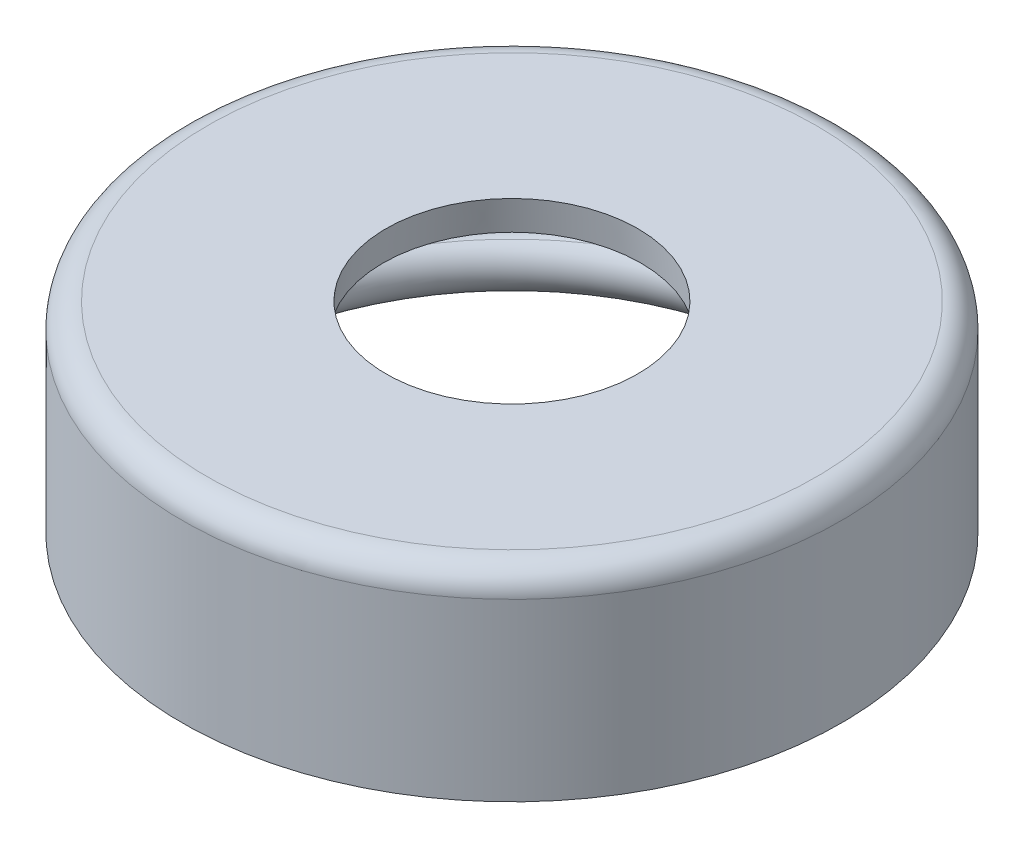
ISO-10303-21;
HEADER;
FILE_DESCRIPTION(('STEP AP214'),'2;1');
FILE_NAME('part.step','',(''),(''),'','','');
FILE_SCHEMA(('AUTOMOTIVE_DESIGN { 1 0 10303 214 1 1 1 1 }'));
ENDSEC;
DATA;
#1=APPLICATION_CONTEXT('core data for automotive mechanical design processes');
#2=APPLICATION_PROTOCOL_DEFINITION('international standard','automotive_design',2000,#1);
#3=PRODUCT_CONTEXT('',#1,'mechanical');
#4=PRODUCT('Part','Part','',(#3));
#5=PRODUCT_RELATED_PRODUCT_CATEGORY('part','',(#4));
#6=PRODUCT_DEFINITION_FORMATION('','',#4);
#7=PRODUCT_DEFINITION_CONTEXT('part definition',#1,'design');
#8=PRODUCT_DEFINITION('design','',#6,#7);
#9=PRODUCT_DEFINITION_SHAPE('','',#8);
#10=(LENGTH_UNIT() NAMED_UNIT(*) SI_UNIT(.MILLI.,.METRE.));
#11=(NAMED_UNIT(*) PLANE_ANGLE_UNIT() SI_UNIT($,.RADIAN.));
#12=(NAMED_UNIT(*) SI_UNIT($,.STERADIAN.) SOLID_ANGLE_UNIT());
#13=UNCERTAINTY_MEASURE_WITH_UNIT(LENGTH_MEASURE(1.E-05),#10,'distance_accuracy_value','');
#14=(GEOMETRIC_REPRESENTATION_CONTEXT(3) GLOBAL_UNCERTAINTY_ASSIGNED_CONTEXT((#13)) GLOBAL_UNIT_ASSIGNED_CONTEXT((#10,
#11,#12)) REPRESENTATION_CONTEXT('',''));
#15=CARTESIAN_POINT('',(0.,0.,0.));
#16=DIRECTION('',(0.,0.,1.));
#17=DIRECTION('',(1.,0.,0.));
#18=AXIS2_PLACEMENT_3D('',#15,#16,#17);
#19=CARTESIAN_POINT('',(0.,0.,0.));
#20=DIRECTION('',(0.,-1.,0.));
#21=DIRECTION('',(0.,0.,-1.));
#22=AXIS2_PLACEMENT_3D('',#19,#20,#21);
#23=CYLINDRICAL_SURFACE('',#22,12.0269);
#24=CARTESIAN_POINT('',(0.,4.99005746268657,0.));
#25=DIRECTION('',(0.,-1.,0.));
#26=DIRECTION('',(0.,0.,-1.));
#27=AXIS2_PLACEMENT_3D('',#24,#25,#26);
#28=CIRCLE('',#27,12.0269);
#29=CARTESIAN_POINT('',(0.,4.99005746268657,-12.0269));
#30=VERTEX_POINT('',#29);
#31=EDGE_CURVE('E62',#30,#30,#28,.T.);
#32=ORIENTED_EDGE('',*,*,#31,.F.);
#33=EDGE_LOOP('',(#32));
#34=FACE_BOUND('',#33,.T.);
#35=CARTESIAN_POINT('',(0.,0.50812943336742,0.));
#36=DIRECTION('',(0.,-1.,0.));
#37=DIRECTION('',(0.,0.,-1.));
#38=AXIS2_PLACEMENT_3D('',#35,#36,#37);
#39=CIRCLE('',#38,12.0269);
#40=CARTESIAN_POINT('',(0.,0.50812943336742,-12.0269));
#41=VERTEX_POINT('',#40);
#42=EDGE_CURVE('E10',#41,#41,#39,.T.);
#43=ORIENTED_EDGE('',*,*,#42,.T.);
#44=EDGE_LOOP('',(#43));
#45=FACE_BOUND('',#44,.T.);
#46=ADVANCED_FACE('F31',(#34,#45),#23,.F.);
#47=CARTESIAN_POINT('',(0.,0.50812943336742,0.));
#48=DIRECTION('',(0.,-1.,0.));
#49=DIRECTION('',(0.,0.,-1.));
#50=AXIS2_PLACEMENT_3D('',#47,#48,#49);
#51=TOROIDAL_SURFACE('',#50,11.5189,0.508);
#52=CARTESIAN_POINT('',(0.,0.0865823747022564,0.));
#53=DIRECTION('',(0.,-1.,0.));
#54=DIRECTION('',(0.,0.,-1.));
#55=AXIS2_PLACEMENT_3D('',#52,#53,#54);
#56=CIRCLE('',#55,11.8023820582167);
#57=CARTESIAN_POINT('',(0.,0.0865823747022564,-11.8023820582167));
#58=VERTEX_POINT('',#57);
#59=EDGE_CURVE('E37',#58,#58,#56,.T.);
#60=ORIENTED_EDGE('',*,*,#59,.T.);
#61=EDGE_LOOP('',(#60));
#62=FACE_BOUND('',#61,.T.);
#63=ORIENTED_EDGE('',*,*,#42,.F.);
#64=EDGE_LOOP('',(#63));
#65=FACE_BOUND('',#64,.T.);
#66=ADVANCED_FACE('F69',(#62,#65),#51,.F.);
#67=CARTESIAN_POINT('',(0.,-0.813842537313431,0.));
#68=DIRECTION('',(0.,-1.,0.));
#69=DIRECTION('',(0.,0.,-1.));
#70=AXIS2_PLACEMENT_3D('',#67,#68,#69);
#71=TOROIDAL_SURFACE('',#70,12.4079,1.08508847565533);
#72=CARTESIAN_POINT('',(0.,-1.82984253731343,0.));
#73=DIRECTION('',(0.,-1.,0.));
#74=DIRECTION('',(0.,0.,-1.));
#75=AXIS2_PLACEMENT_3D('',#72,#73,#74);
#76=CIRCLE('',#75,12.0269);
#77=CARTESIAN_POINT('',(0.,-1.82984253731343,-12.0269));
#78=VERTEX_POINT('',#77);
#79=EDGE_CURVE('E41',#78,#78,#76,.T.);
#80=ORIENTED_EDGE('',*,*,#79,.T.);
#81=EDGE_LOOP('',(#80));
#82=FACE_BOUND('',#81,.T.);
#83=ORIENTED_EDGE('',*,*,#59,.F.);
#84=EDGE_LOOP('',(#83));
#85=FACE_BOUND('',#84,.T.);
#86=ADVANCED_FACE('F73',(#82,#85),#71,.T.);
#87=CARTESIAN_POINT('',(0.,-1.82984253731343,0.));
#88=DIRECTION('',(0.,1.,0.));
#89=DIRECTION('',(0.,0.,1.));
#90=AXIS2_PLACEMENT_3D('',#87,#88,#89);
#91=PLANE('',#90);
#92=ORIENTED_EDGE('',*,*,#79,.F.);
#93=EDGE_LOOP('',(#92));
#94=FACE_BOUND('',#93,.T.);
#95=CARTESIAN_POINT('',(0.,-1.82984253731343,0.));
#96=DIRECTION('',(0.,-1.,0.));
#97=DIRECTION('',(0.,0.,-1.));
#98=AXIS2_PLACEMENT_3D('',#95,#96,#97);
#99=CIRCLE('',#98,13.2969);
#100=CARTESIAN_POINT('',(0.,-1.82984253731343,-13.2969));
#101=VERTEX_POINT('',#100);
#102=EDGE_CURVE('E45',#101,#101,#99,.T.);
#103=ORIENTED_EDGE('',*,*,#102,.T.);
#104=EDGE_LOOP('',(#103));
#105=FACE_BOUND('',#104,.T.);
#106=ADVANCED_FACE('F77',(#94,#105),#91,.F.);
#107=CARTESIAN_POINT('',(0.,0.,0.));
#108=DIRECTION('',(0.,-1.,0.));
#109=DIRECTION('',(0.,0.,-1.));
#110=AXIS2_PLACEMENT_3D('',#107,#108,#109);
#111=CYLINDRICAL_SURFACE('',#110,13.2969);
#112=ORIENTED_EDGE('',*,*,#102,.F.);
#113=EDGE_LOOP('',(#112));
#114=FACE_BOUND('',#113,.T.);
#115=CARTESIAN_POINT('',(0.,5.24405746268656,0.));
#116=DIRECTION('',(0.,-1.,0.));
#117=DIRECTION('',(0.,0.,-1.));
#118=AXIS2_PLACEMENT_3D('',#115,#116,#117);
#119=CIRCLE('',#118,13.2969);
#120=CARTESIAN_POINT('',(0.,5.24405746268656,-13.2969));
#121=VERTEX_POINT('',#120);
#122=EDGE_CURVE('E50',#121,#121,#119,.T.);
#123=ORIENTED_EDGE('',*,*,#122,.T.);
#124=EDGE_LOOP('',(#123));
#125=FACE_BOUND('',#124,.T.);
#126=ADVANCED_FACE('F84',(#114,#125),#111,.T.);
#127=CARTESIAN_POINT('',(0.,5.24405746268657,0.));
#128=DIRECTION('',(0.,-1.,0.));
#129=DIRECTION('',(0.,0.,-1.));
#130=AXIS2_PLACEMENT_3D('',#127,#128,#129);
#131=TOROIDAL_SURFACE('',#130,12.2809,1.016);
#132=ORIENTED_EDGE('',*,*,#122,.F.);
#133=EDGE_LOOP('',(#132));
#134=FACE_BOUND('',#133,.T.);
#135=CARTESIAN_POINT('',(0.,6.26005746268657,0.));
#136=DIRECTION('',(0.,-1.,0.));
#137=DIRECTION('',(0.,0.,-1.));
#138=AXIS2_PLACEMENT_3D('',#135,#136,#137);
#139=CIRCLE('',#138,12.2809);
#140=CARTESIAN_POINT('',(0.,6.26005746268657,-12.2809));
#141=VERTEX_POINT('',#140);
#142=EDGE_CURVE('E53',#141,#141,#139,.T.);
#143=ORIENTED_EDGE('',*,*,#142,.T.);
#144=EDGE_LOOP('',(#143));
#145=FACE_BOUND('',#144,.T.);
#146=ADVANCED_FACE('F88',(#134,#145),#131,.T.);
#147=CARTESIAN_POINT('',(0.,6.26005746268657,0.));
#148=DIRECTION('',(0.,-1.,0.));
#149=DIRECTION('',(0.,0.,-1.));
#150=AXIS2_PLACEMENT_3D('',#147,#148,#149);
#151=PLANE('',#150);
#152=ORIENTED_EDGE('',*,*,#142,.F.);
#153=EDGE_LOOP('',(#152));
#154=FACE_BOUND('',#153,.T.);
#155=CARTESIAN_POINT('',(0.,6.26005746268657,0.));
#156=DIRECTION('',(0.,-1.,0.));
#157=DIRECTION('',(0.,0.,-1.));
#158=AXIS2_PLACEMENT_3D('',#155,#156,#157);
#159=CIRCLE('',#158,5.08);
#160=CARTESIAN_POINT('',(0.,6.26005746268657,-5.08));
#161=VERTEX_POINT('',#160);
#162=EDGE_CURVE('E56',#161,#161,#159,.T.);
#163=ORIENTED_EDGE('',*,*,#162,.T.);
#164=EDGE_LOOP('',(#163));
#165=FACE_BOUND('',#164,.T.);
#166=ADVANCED_FACE('F92',(#154,#165),#151,.F.);
#167=CARTESIAN_POINT('',(0.,4.99005746268657,0.));
#168=DIRECTION('',(0.,-1.,0.));
#169=DIRECTION('',(0.,0.,-1.));
#170=AXIS2_PLACEMENT_3D('',#167,#168,#169);
#171=CONICAL_SURFACE('',#170,5.207,0.0996686524911622);
#172=ORIENTED_EDGE('',*,*,#162,.F.);
#173=EDGE_LOOP('',(#172));
#174=FACE_BOUND('',#173,.T.);
#175=CARTESIAN_POINT('',(0.,4.99005746268657,0.));
#176=DIRECTION('',(0.,-1.,0.));
#177=DIRECTION('',(0.,0.,-1.));
#178=AXIS2_PLACEMENT_3D('',#175,#176,#177);
#179=CIRCLE('',#178,5.207);
#180=CARTESIAN_POINT('',(0.,4.99005746268657,-5.207));
#181=VERTEX_POINT('',#180);
#182=EDGE_CURVE('E59',#181,#181,#179,.T.);
#183=ORIENTED_EDGE('',*,*,#182,.T.);
#184=EDGE_LOOP('',(#183));
#185=FACE_BOUND('',#184,.T.);
#186=ADVANCED_FACE('F96',(#174,#185),#171,.F.);
#187=CARTESIAN_POINT('',(0.,4.99005746268657,0.));
#188=DIRECTION('',(0.,1.,0.));
#189=DIRECTION('',(0.,0.,1.));
#190=AXIS2_PLACEMENT_3D('',#187,#188,#189);
#191=PLANE('',#190);
#192=ORIENTED_EDGE('',*,*,#182,.F.);
#193=EDGE_LOOP('',(#192));
#194=FACE_BOUND('',#193,.T.);
#195=ORIENTED_EDGE('',*,*,#31,.T.);
#196=EDGE_LOOP('',(#195));
#197=FACE_BOUND('',#196,.T.);
#198=ADVANCED_FACE('F66',(#194,#197),#191,.F.);
#199=CLOSED_SHELL('',(#46,#66,#86,#106,#126,#146,#166,#186,#198));
#200=MANIFOLD_SOLID_BREP('B2',#199);
#201=ADVANCED_BREP_SHAPE_REPRESENTATION('',(#18,#200),#14);
#202=SHAPE_DEFINITION_REPRESENTATION(#9,#201);
ENDSEC;
END-ISO-10303-21;
